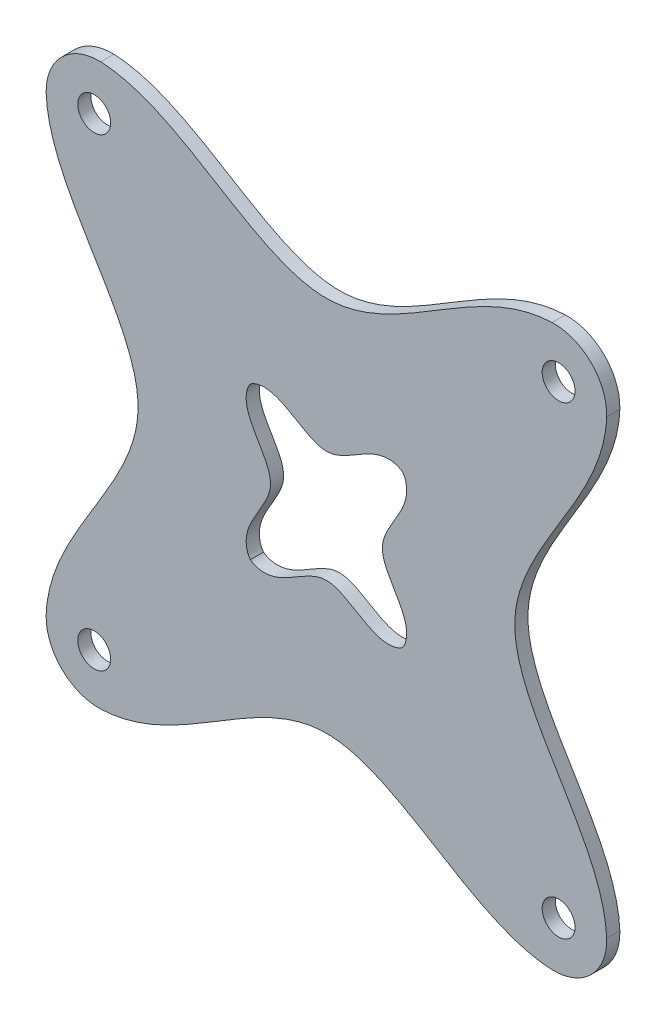
ISO-10303-21;
HEADER;
FILE_DESCRIPTION(('STEP AP214'),'2;1');
FILE_NAME('part.step','',(''),(''),'','','');
FILE_SCHEMA(('AUTOMOTIVE_DESIGN { 1 0 10303 214 1 1 1 1 }'));
ENDSEC;
DATA;
#1=APPLICATION_CONTEXT('core data for automotive mechanical design processes');
#2=APPLICATION_PROTOCOL_DEFINITION('international standard','automotive_design',2000,#1);
#3=PRODUCT_CONTEXT('',#1,'mechanical');
#4=PRODUCT('Part','Part','',(#3));
#5=PRODUCT_RELATED_PRODUCT_CATEGORY('part','',(#4));
#6=PRODUCT_DEFINITION_FORMATION('','',#4);
#7=PRODUCT_DEFINITION_CONTEXT('part definition',#1,'design');
#8=PRODUCT_DEFINITION('design','',#6,#7);
#9=PRODUCT_DEFINITION_SHAPE('','',#8);
#10=(LENGTH_UNIT() NAMED_UNIT(*) SI_UNIT(.MILLI.,.METRE.));
#11=(NAMED_UNIT(*) PLANE_ANGLE_UNIT() SI_UNIT($,.RADIAN.));
#12=(NAMED_UNIT(*) SI_UNIT($,.STERADIAN.) SOLID_ANGLE_UNIT());
#13=UNCERTAINTY_MEASURE_WITH_UNIT(LENGTH_MEASURE(1.E-05),#10,'distance_accuracy_value','');
#14=(GEOMETRIC_REPRESENTATION_CONTEXT(3) GLOBAL_UNCERTAINTY_ASSIGNED_CONTEXT((#13)) GLOBAL_UNIT_ASSIGNED_CONTEXT((#10,
#11,#12)) REPRESENTATION_CONTEXT('',''));
#15=CARTESIAN_POINT('',(0.,0.,0.));
#16=DIRECTION('',(0.,0.,1.));
#17=DIRECTION('',(1.,0.,0.));
#18=AXIS2_PLACEMENT_3D('',#15,#16,#17);
#19=CARTESIAN_POINT('',(21.9654081761549,-21.9654081758046,0.));
#20=DIRECTION('',(0.,0.,-1.));
#21=DIRECTION('',(-1.,0.,0.));
#22=AXIS2_PLACEMENT_3D('',#19,#20,#21);
#23=CYLINDRICAL_SURFACE('',#22,5.08);
#24=DIRECTION('',(0.,0.,-1.));
#25=VECTOR('',#24,1.);
#26=CARTESIAN_POINT('',(21.7825332933206,-27.0421154528917,0.));
#27=LINE('',#26,#25);
#28=CARTESIAN_POINT('',(21.7825332933206,-27.0421154528917,0.));
#29=VERTEX_POINT('',#28);
#30=CARTESIAN_POINT('',(21.7825332933206,-27.0421154528917,1.27));
#31=VERTEX_POINT('',#30);
#32=EDGE_CURVE('E257',#29,#31,#27,.F.);
#33=ORIENTED_EDGE('',*,*,#32,.F.);
#34=CARTESIAN_POINT('',(21.9654081761549,-21.9654081758046,0.));
#35=DIRECTION('',(0.,0.,1.));
#36=DIRECTION('',(1.,0.,0.));
#37=AXIS2_PLACEMENT_3D('',#34,#35,#36);
#38=CIRCLE('',#37,5.08);
#39=CARTESIAN_POINT('',(27.0421154532867,-21.782533294215,0.));
#40=VERTEX_POINT('',#39);
#41=EDGE_CURVE('E42',#40,#29,#38,.F.);
#42=ORIENTED_EDGE('',*,*,#41,.F.);
#43=DIRECTION('',(0.,0.,-1.));
#44=VECTOR('',#43,1.);
#45=CARTESIAN_POINT('',(27.0421154532867,-21.782533294215,1.27));
#46=LINE('',#45,#44);
#47=CARTESIAN_POINT('',(27.0421154532867,-21.782533294215,1.27));
#48=VERTEX_POINT('',#47);
#49=EDGE_CURVE('E260',#48,#40,#46,.T.);
#50=ORIENTED_EDGE('',*,*,#49,.F.);
#51=CARTESIAN_POINT('',(21.9654081761549,-21.9654081758046,1.27));
#52=DIRECTION('',(0.,0.,1.));
#53=DIRECTION('',(1.,0.,0.));
#54=AXIS2_PLACEMENT_3D('',#51,#52,#53);
#55=CIRCLE('',#54,5.08);
#56=EDGE_CURVE('E11',#31,#48,#55,.T.);
#57=ORIENTED_EDGE('',*,*,#56,.F.);
#58=EDGE_LOOP('',(#33,#42,#50,#57));
#59=FACE_BOUND('',#58,.T.);
#60=ADVANCED_FACE('F35',(#59),#23,.T.);
#61=CARTESIAN_POINT('',(-21.9654081757839,21.965408175578,1.27));
#62=DIRECTION('',(0.,0.,-1.));
#63=DIRECTION('',(-1.,0.,0.));
#64=AXIS2_PLACEMENT_3D('',#61,#62,#63);
#65=CYLINDRICAL_SURFACE('',#64,5.08);
#66=DIRECTION('',(0.,0.,-1.));
#67=VECTOR('',#66,1.);
#68=CARTESIAN_POINT('',(-27.0421154528519,21.7825332922171,1.27));
#69=LINE('',#68,#67);
#70=CARTESIAN_POINT('',(-27.0421154528519,21.7825332922171,1.27));
#71=VERTEX_POINT('',#70);
#72=CARTESIAN_POINT('',(-27.0421154528519,21.7825332922171,0.));
#73=VERTEX_POINT('',#72);
#74=EDGE_CURVE('E247',#71,#73,#69,.T.);
#75=ORIENTED_EDGE('',*,*,#74,.F.);
#76=CARTESIAN_POINT('',(-21.9654081757839,21.965408175578,1.27));
#77=DIRECTION('',(0.,0.,1.));
#78=DIRECTION('',(1.,0.,0.));
#79=AXIS2_PLACEMENT_3D('',#76,#77,#78);
#80=CIRCLE('',#79,5.08);
#81=CARTESIAN_POINT('',(-21.7825332916942,27.0421154526198,1.27));
#82=VERTEX_POINT('',#81);
#83=EDGE_CURVE('E253',#82,#71,#80,.T.);
#84=ORIENTED_EDGE('',*,*,#83,.F.);
#85=DIRECTION('',(0.,0.,-1.));
#86=VECTOR('',#85,1.);
#87=CARTESIAN_POINT('',(-21.7825332916942,27.0421154526198,0.));
#88=LINE('',#87,#86);
#89=CARTESIAN_POINT('',(-21.7825332916942,27.0421154526198,0.));
#90=VERTEX_POINT('',#89);
#91=EDGE_CURVE('E250',#90,#82,#88,.F.);
#92=ORIENTED_EDGE('',*,*,#91,.F.);
#93=CARTESIAN_POINT('',(-21.9654081757839,21.965408175578,0.));
#94=DIRECTION('',(0.,0.,1.));
#95=DIRECTION('',(1.,0.,0.));
#96=AXIS2_PLACEMENT_3D('',#93,#94,#95);
#97=CIRCLE('',#96,5.08);
#98=EDGE_CURVE('E255',#73,#90,#97,.F.);
#99=ORIENTED_EDGE('',*,*,#98,.F.);
#100=EDGE_LOOP('',(#75,#84,#92,#99));
#101=FACE_BOUND('',#100,.T.);
#102=ADVANCED_FACE('F285',(#101),#65,.T.);
#103=CARTESIAN_POINT('',(-21.9654081755703,-21.9654081755702,1.27));
#104=DIRECTION('',(0.,0.,-1.));
#105=DIRECTION('',(-1.,0.,0.));
#106=AXIS2_PLACEMENT_3D('',#103,#104,#105);
#107=CYLINDRICAL_SURFACE('',#106,5.08);
#108=DIRECTION('',(0.,0.,-1.));
#109=VECTOR('',#108,1.);
#110=CARTESIAN_POINT('',(-21.7825332912855,-27.042115452605,1.27));
#111=LINE('',#110,#109);
#112=CARTESIAN_POINT('',(-21.7825332912855,-27.042115452605,1.27));
#113=VERTEX_POINT('',#112);
#114=CARTESIAN_POINT('',(-21.7825332912855,-27.042115452605,0.));
#115=VERTEX_POINT('',#114);
#116=EDGE_CURVE('E236',#113,#115,#111,.T.);
#117=ORIENTED_EDGE('',*,*,#116,.F.);
#118=CARTESIAN_POINT('',(-21.9654081755703,-21.9654081755702,1.27));
#119=DIRECTION('',(0.,0.,1.));
#120=DIRECTION('',(1.,0.,0.));
#121=AXIS2_PLACEMENT_3D('',#118,#119,#120);
#122=CIRCLE('',#121,5.08);
#123=CARTESIAN_POINT('',(-27.042115452605,-21.7825332912856,1.27));
#124=VERTEX_POINT('',#123);
#125=EDGE_CURVE('E242',#124,#113,#122,.T.);
#126=ORIENTED_EDGE('',*,*,#125,.F.);
#127=DIRECTION('',(0.,0.,-1.));
#128=VECTOR('',#127,1.);
#129=CARTESIAN_POINT('',(-27.042115452605,-21.7825332912856,0.));
#130=LINE('',#129,#128);
#131=CARTESIAN_POINT('',(-27.042115452605,-21.7825332912856,0.));
#132=VERTEX_POINT('',#131);
#133=EDGE_CURVE('E239',#132,#124,#130,.F.);
#134=ORIENTED_EDGE('',*,*,#133,.F.);
#135=CARTESIAN_POINT('',(-21.9654081755703,-21.9654081755702,0.));
#136=DIRECTION('',(0.,0.,1.));
#137=DIRECTION('',(1.,0.,0.));
#138=AXIS2_PLACEMENT_3D('',#135,#136,#137);
#139=CIRCLE('',#138,5.08);
#140=EDGE_CURVE('E244',#115,#132,#139,.F.);
#141=ORIENTED_EDGE('',*,*,#140,.F.);
#142=EDGE_LOOP('',(#117,#126,#134,#141));
#143=FACE_BOUND('',#142,.T.);
#144=ADVANCED_FACE('F275',(#143),#107,.T.);
#145=CARTESIAN_POINT('',(21.965408175107,21.9654081757669,0.));
#146=DIRECTION('',(0.,0.,-1.));
#147=DIRECTION('',(-1.,0.,0.));
#148=AXIS2_PLACEMENT_3D('',#145,#146,#147);
#149=CYLINDRICAL_SURFACE('',#148,5.08);
#150=DIRECTION('',(0.,0.,-1.));
#151=VECTOR('',#150,1.);
#152=CARTESIAN_POINT('',(27.0421154520755,21.7825332896429,0.));
#153=LINE('',#152,#151);
#154=CARTESIAN_POINT('',(27.0421154520755,21.7825332896429,0.));
#155=VERTEX_POINT('',#154);
#156=CARTESIAN_POINT('',(27.0421154520755,21.7825332896429,1.27));
#157=VERTEX_POINT('',#156);
#158=EDGE_CURVE('E185',#155,#157,#153,.F.);
#159=ORIENTED_EDGE('',*,*,#158,.F.);
#160=CARTESIAN_POINT('',(21.965408175107,21.9654081757669,0.));
#161=DIRECTION('',(0.,0.,1.));
#162=DIRECTION('',(1.,0.,0.));
#163=AXIS2_PLACEMENT_3D('',#160,#161,#162);
#164=CIRCLE('',#163,5.08);
#165=CARTESIAN_POINT('',(21.7825332913162,27.0421154528195,0.));
#166=VERTEX_POINT('',#165);
#167=EDGE_CURVE('E231',#166,#155,#164,.F.);
#168=ORIENTED_EDGE('',*,*,#167,.F.);
#169=DIRECTION('',(0.,0.,-1.));
#170=VECTOR('',#169,1.);
#171=CARTESIAN_POINT('',(21.7825332913162,27.0421154528195,1.27));
#172=LINE('',#171,#170);
#173=CARTESIAN_POINT('',(21.7825332913162,27.0421154528195,1.27));
#174=VERTEX_POINT('',#173);
#175=EDGE_CURVE('E228',#174,#166,#172,.T.);
#176=ORIENTED_EDGE('',*,*,#175,.F.);
#177=CARTESIAN_POINT('',(21.965408175107,21.9654081757669,1.27));
#178=DIRECTION('',(0.,0.,1.));
#179=DIRECTION('',(1.,0.,0.));
#180=AXIS2_PLACEMENT_3D('',#177,#178,#179);
#181=CIRCLE('',#180,5.08);
#182=EDGE_CURVE('E234',#157,#174,#181,.T.);
#183=ORIENTED_EDGE('',*,*,#182,.F.);
#184=EDGE_LOOP('',(#159,#168,#176,#183));
#185=FACE_BOUND('',#184,.T.);
#186=ADVANCED_FACE('F291',(#185),#149,.T.);
#187=CARTESIAN_POINT('',(-26.0784512242138,26.0784512242138,1.27));
#188=CARTESIAN_POINT('',(-26.4668926901077,25.5950306717712,1.27));
#189=CARTESIAN_POINT('',(-29.5054367703831,16.2013722905775,1.27));
#190=CARTESIAN_POINT('',(-7.63665032782753,4.97957528785472E-10,1.27));
#191=CARTESIAN_POINT('',(-29.505436769622,-16.2013722917142,1.27));
#192=CARTESIAN_POINT('',(-26.4668926901906,-25.5950306717568,1.27));
#193=CARTESIAN_POINT('',(-26.0784512242138,-26.0784512242138,1.27));
#194=B_SPLINE_CURVE_WITH_KNOTS('',3,(#187,#188,#189,#190,#191,#192,#193),.UNSPECIFIED.,.F.,.F.,
(4,1,1,1,4),(0.0327667540954913,0.0655335081872653,0.49999999999634,0.934466491805415,
0.967233245900849),.UNSPECIFIED.);
#195=DIRECTION('',(0.,0.,-1.));
#196=VECTOR('',#195,1.);
#197=SURFACE_OF_LINEAR_EXTRUSION('',#194,#196);
#198=EDGE_CURVE('E222',#71,#124,#194,.T.);
#199=ORIENTED_EDGE('',*,*,#198,.F.);
#200=ORIENTED_EDGE('',*,*,#74,.T.);
#201=CARTESIAN_POINT('',(-26.0784512242138,26.0784512242138,0.));
#202=CARTESIAN_POINT('',(-26.4668926901077,25.5950306717712,0.));
#203=CARTESIAN_POINT('',(-29.5054367703831,16.2013722905775,0.));
#204=CARTESIAN_POINT('',(-7.63665032782753,4.97957528785472E-10,0.));
#205=CARTESIAN_POINT('',(-29.505436769622,-16.2013722917142,0.));
#206=CARTESIAN_POINT('',(-26.4668926901906,-25.5950306717568,0.));
#207=CARTESIAN_POINT('',(-26.0784512242138,-26.0784512242138,0.));
#208=B_SPLINE_CURVE_WITH_KNOTS('',3,(#201,#202,#203,#204,#205,#206,#207),.UNSPECIFIED.,.F.,.F.,
(4,1,1,1,4),(0.0327667540954913,0.0655335081872653,0.49999999999634,0.934466491805415,
0.967233245900849),.UNSPECIFIED.);
#209=EDGE_CURVE('E191',#73,#132,#208,.T.);
#210=ORIENTED_EDGE('',*,*,#209,.T.);
#211=ORIENTED_EDGE('',*,*,#133,.T.);
#212=EDGE_LOOP('',(#199,#200,#210,#211));
#213=FACE_BOUND('',#212,.T.);
#214=ADVANCED_FACE('F282',(#213),#197,.F.);
#215=CARTESIAN_POINT('',(-26.0784512242138,-26.0784512242138,1.27));
#216=CARTESIAN_POINT('',(-25.5950306717568,-26.4668926901906,1.27));
#217=CARTESIAN_POINT('',(-16.2013722917143,-29.5054367696219,1.27));
#218=CARTESIAN_POINT('',(4.97995116026007E-10,-7.63665032782758,1.27));
#219=CARTESIAN_POINT('',(16.2013722905775,-29.505436770383,1.27));
#220=CARTESIAN_POINT('',(25.5950306717712,-26.4668926901077,1.27));
#221=CARTESIAN_POINT('',(26.0784512242138,-26.0784512242138,1.27));
#222=B_SPLINE_CURVE_WITH_KNOTS('',3,(#215,#216,#217,#218,#219,#220,#221),.UNSPECIFIED.,.F.,.F.,
(4,1,1,1,4),(0.0327667540954913,0.0655335081909255,0.5,0.934466491809075,0.967233245900849),.UNSPECIFIED.);
#223=DIRECTION('',(0.,0.,-1.));
#224=VECTOR('',#223,1.);
#225=SURFACE_OF_LINEAR_EXTRUSION('',#222,#224);
#226=CARTESIAN_POINT('',(-26.0784512242138,-26.0784512242138,0.));
#227=CARTESIAN_POINT('',(-25.5950306717568,-26.4668926901906,0.));
#228=CARTESIAN_POINT('',(-16.2013722917143,-29.5054367696219,0.));
#229=CARTESIAN_POINT('',(4.97995116026007E-10,-7.63665032782758,0.));
#230=CARTESIAN_POINT('',(16.2013722905775,-29.505436770383,0.));
#231=CARTESIAN_POINT('',(25.5950306717712,-26.4668926901077,0.));
#232=CARTESIAN_POINT('',(26.0784512242138,-26.0784512242138,0.));
#233=B_SPLINE_CURVE_WITH_KNOTS('',3,(#226,#227,#228,#229,#230,#231,#232),.UNSPECIFIED.,.F.,.F.,
(4,1,1,1,4),(0.0327667540954913,0.0655335081909255,0.5,0.934466491809075,0.967233245900849),.UNSPECIFIED.);
#234=EDGE_CURVE('E198',#115,#29,#233,.T.);
#235=ORIENTED_EDGE('',*,*,#234,.T.);
#236=ORIENTED_EDGE('',*,*,#32,.T.);
#237=EDGE_CURVE('E272',#113,#31,#222,.T.);
#238=ORIENTED_EDGE('',*,*,#237,.F.);
#239=ORIENTED_EDGE('',*,*,#116,.T.);
#240=EDGE_LOOP('',(#235,#236,#238,#239));
#241=FACE_BOUND('',#240,.T.);
#242=ADVANCED_FACE('F270',(#241),#225,.F.);
#243=CARTESIAN_POINT('',(26.0784512242138,-26.0784512242138,1.27));
#244=CARTESIAN_POINT('',(26.4668926899683,-25.5950306717962,1.27));
#245=CARTESIAN_POINT('',(29.5054367716601,-16.201372288648,1.27));
#246=CARTESIAN_POINT('',(7.63665032804387,-2.44868862485965E-09,1.27));
#247=CARTESIAN_POINT('',(29.5054367679272,16.2013722942378,1.27));
#248=CARTESIAN_POINT('',(26.4668926903748,25.5950306717246,1.27));
#249=CARTESIAN_POINT('',(26.0784512242138,26.0784512242138,1.27));
#250=B_SPLINE_CURVE_WITH_KNOTS('',3,(#243,#244,#245,#246,#247,#248,#249),.UNSPECIFIED.,.F.,.F.,
(4,1,1,1,4),(0.0327667541053309,0.0655335081909253,0.5,0.934466491809075,0.967233245912644),.UNSPECIFIED.);
#251=DIRECTION('',(0.,0.,-1.));
#252=VECTOR('',#251,1.);
#253=SURFACE_OF_LINEAR_EXTRUSION('',#250,#252);
#254=EDGE_CURVE('E186',#48,#157,#250,.T.);
#255=ORIENTED_EDGE('',*,*,#254,.F.);
#256=ORIENTED_EDGE('',*,*,#49,.T.);
#257=CARTESIAN_POINT('',(26.0784512242138,-26.0784512242138,0.));
#258=CARTESIAN_POINT('',(26.4668926899683,-25.5950306717962,0.));
#259=CARTESIAN_POINT('',(29.5054367716601,-16.201372288648,0.));
#260=CARTESIAN_POINT('',(7.63665032804387,-2.44868862485965E-09,0.));
#261=CARTESIAN_POINT('',(29.5054367679272,16.2013722942378,0.));
#262=CARTESIAN_POINT('',(26.4668926903748,25.5950306717246,0.));
#263=CARTESIAN_POINT('',(26.0784512242138,26.0784512242138,0.));
#264=B_SPLINE_CURVE_WITH_KNOTS('',3,(#257,#258,#259,#260,#261,#262,#263),.UNSPECIFIED.,.F.,.F.,
(4,1,1,1,4),(0.0327667541053309,0.0655335081909253,0.5,0.934466491809075,0.967233245912644),.UNSPECIFIED.);
#265=EDGE_CURVE('E207',#40,#155,#264,.T.);
#266=ORIENTED_EDGE('',*,*,#265,.T.);
#267=ORIENTED_EDGE('',*,*,#158,.T.);
#268=EDGE_LOOP('',(#255,#256,#266,#267));
#269=FACE_BOUND('',#268,.T.);
#270=ADVANCED_FACE('F175',(#269),#253,.F.);
#271=CARTESIAN_POINT('',(26.0784512242138,26.0784512242138,1.27));
#272=CARTESIAN_POINT('',(25.5950306717712,26.4668926901077,1.27));
#273=CARTESIAN_POINT('',(16.2013722905775,29.5054367703831,1.27));
#274=CARTESIAN_POINT('',(4.97927742693554E-10,7.63665032782749,1.27));
#275=CARTESIAN_POINT('',(-16.2013722917142,29.505436769622,1.27));
#276=CARTESIAN_POINT('',(-25.5950306717568,26.4668926901906,1.27));
#277=CARTESIAN_POINT('',(-26.0784512242138,26.0784512242138,1.27));
#278=B_SPLINE_CURVE_WITH_KNOTS('',3,(#271,#272,#273,#274,#275,#276,#277),.UNSPECIFIED.,.F.,.F.,
(4,1,1,1,4),(0.0327667540954913,0.0655335081872656,0.49999999999634,0.934466491805415,
0.967233245900849),.UNSPECIFIED.);
#279=DIRECTION('',(0.,0.,-1.));
#280=VECTOR('',#279,1.);
#281=SURFACE_OF_LINEAR_EXTRUSION('',#278,#280);
#282=CARTESIAN_POINT('',(26.0784512242138,26.0784512242138,0.));
#283=CARTESIAN_POINT('',(25.5950306717712,26.4668926901077,0.));
#284=CARTESIAN_POINT('',(16.2013722905775,29.5054367703831,0.));
#285=CARTESIAN_POINT('',(4.97927742693554E-10,7.63665032782749,0.));
#286=CARTESIAN_POINT('',(-16.2013722917142,29.505436769622,0.));
#287=CARTESIAN_POINT('',(-25.5950306717568,26.4668926901906,0.));
#288=CARTESIAN_POINT('',(-26.0784512242138,26.0784512242138,0.));
#289=B_SPLINE_CURVE_WITH_KNOTS('',3,(#282,#283,#284,#285,#286,#287,#288),.UNSPECIFIED.,.F.,.F.,
(4,1,1,1,4),(0.0327667540954913,0.0655335081872656,0.49999999999634,0.934466491805415,
0.967233245900849),.UNSPECIFIED.);
#290=EDGE_CURVE('E214',#166,#90,#289,.T.);
#291=ORIENTED_EDGE('',*,*,#290,.T.);
#292=ORIENTED_EDGE('',*,*,#91,.T.);
#293=EDGE_CURVE('E179',#174,#82,#278,.T.);
#294=ORIENTED_EDGE('',*,*,#293,.F.);
#295=ORIENTED_EDGE('',*,*,#175,.T.);
#296=EDGE_LOOP('',(#291,#292,#294,#295));
#297=FACE_BOUND('',#296,.T.);
#298=ADVANCED_FACE('F167',(#297),#281,.F.);
#299=CARTESIAN_POINT('',(-18.1737,-9.863950377484E-11,1.27));
#300=DIRECTION('',(0.,0.,1.));
#301=DIRECTION('',(1.,0.,0.));
#302=AXIS2_PLACEMENT_3D('',#299,#300,#301);
#303=PLANE('',#302);
#304=CARTESIAN_POINT('',(22.4057390220675,-22.4057390220675,1.27));
#305=DIRECTION('',(0.,0.,1.));
#306=DIRECTION('',(1.,0.,0.));
#307=AXIS2_PLACEMENT_3D('',#304,#305,#306);
#308=CIRCLE('',#307,1.5875);
#309=CARTESIAN_POINT('',(23.9932390220675,-22.4057390220675,1.27));
#310=VERTEX_POINT('',#309);
#311=EDGE_CURVE('E487',#310,#310,#308,.T.);
#312=ORIENTED_EDGE('',*,*,#311,.F.);
#313=EDGE_LOOP('',(#312));
#314=FACE_BOUND('',#313,.T.);
#315=CARTESIAN_POINT('',(22.4057390220675,22.4057390220675,1.27));
#316=DIRECTION('',(0.,0.,1.));
#317=DIRECTION('',(1.,0.,0.));
#318=AXIS2_PLACEMENT_3D('',#315,#316,#317);
#319=CIRCLE('',#318,1.5875);
#320=CARTESIAN_POINT('',(23.9932390220675,22.4057390220675,1.27));
#321=VERTEX_POINT('',#320);
#322=EDGE_CURVE('E481',#321,#321,#319,.T.);
#323=ORIENTED_EDGE('',*,*,#322,.F.);
#324=EDGE_LOOP('',(#323));
#325=FACE_BOUND('',#324,.T.);
#326=CARTESIAN_POINT('',(-22.4057390220675,22.4057390220675,1.27));
#327=DIRECTION('',(0.,0.,1.));
#328=DIRECTION('',(1.,0.,0.));
#329=AXIS2_PLACEMENT_3D('',#326,#327,#328);
#330=CIRCLE('',#329,1.5875);
#331=CARTESIAN_POINT('',(-20.8182390220675,22.4057390220675,1.27));
#332=VERTEX_POINT('',#331);
#333=EDGE_CURVE('E475',#332,#332,#330,.T.);
#334=ORIENTED_EDGE('',*,*,#333,.F.);
#335=EDGE_LOOP('',(#334));
#336=FACE_BOUND('',#335,.T.);
#337=CARTESIAN_POINT('',(-22.4057390220675,-22.4057390220675,1.27));
#338=DIRECTION('',(0.,0.,1.));
#339=DIRECTION('',(1.,0.,0.));
#340=AXIS2_PLACEMENT_3D('',#337,#338,#339);
#341=CIRCLE('',#340,1.5875);
#342=CARTESIAN_POINT('',(-20.8182390220675,-22.4057390220675,1.27));
#343=VERTEX_POINT('',#342);
#344=EDGE_CURVE('E149',#343,#343,#341,.T.);
#345=ORIENTED_EDGE('',*,*,#344,.F.);
#346=EDGE_LOOP('',(#345));
#347=FACE_BOUND('',#346,.T.);
#348=CARTESIAN_POINT('',(-7.33692561210691,7.33692561210692,1.27));
#349=CARTESIAN_POINT('',(-7.53999049262532,7.09456495387122,1.27));
#350=CARTESIAN_POINT('',(-8.46751062910925,4.44168544808401,1.27));
#351=CARTESIAN_POINT('',(-2.70941912041997,-6.99705514788278E-12,1.27));
#352=CARTESIAN_POINT('',(-8.46751062911856,-4.44168544806628,1.27));
#353=CARTESIAN_POINT('',(-7.53999049262328,-7.09456495387186,1.27));
#354=CARTESIAN_POINT('',(-7.33692561210692,-7.33692561210691,1.27));
#355=B_SPLINE_CURVE_WITH_KNOTS('',3,(#348,#349,#350,#351,#352,#353,#354),.UNSPECIFIED.,.F.,.F.,
(4,1,1,1,4),(0.0553210234955911,0.110642046982983,0.5,0.889357953017018,0.944678976504082),.UNSPECIFIED.);
#356=CARTESIAN_POINT('',(-7.33692561210691,7.33692561210692,1.27));
#357=VERTEX_POINT('',#356);
#358=CARTESIAN_POINT('',(-7.33692561210692,-7.33692561210691,1.27));
#359=VERTEX_POINT('',#358);
#360=EDGE_CURVE('E49',#357,#359,#355,.T.);
#361=ORIENTED_EDGE('',*,*,#360,.F.);
#362=CARTESIAN_POINT('',(7.33692561210692,7.33692561210692,1.27));
#363=CARTESIAN_POINT('',(7.09456495387186,7.53999049262328,1.27));
#364=CARTESIAN_POINT('',(4.44168544806626,8.46751062911858,1.27));
#365=CARTESIAN_POINT('',(7.03317761171436E-12,2.70941912041998,1.27));
#366=CARTESIAN_POINT('',(-4.44168544808407,8.46751062910923,1.27));
#367=CARTESIAN_POINT('',(-7.09456495387122,7.53999049262532,1.27));
#368=CARTESIAN_POINT('',(-7.33692561210691,7.33692561210692,1.27));
#369=B_SPLINE_CURVE_WITH_KNOTS('',3,(#362,#363,#364,#365,#366,#367,#368),.UNSPECIFIED.,.F.,.F.,
(4,1,1,1,4),(0.0553210234955904,0.110642046982654,0.499999999999672,0.889357953016689,
0.944678976504082),.UNSPECIFIED.);
#370=CARTESIAN_POINT('',(7.33692561210692,7.33692561210692,1.27));
#371=VERTEX_POINT('',#370);
#372=EDGE_CURVE('E140',#371,#357,#369,.T.);
#373=ORIENTED_EDGE('',*,*,#372,.F.);
#374=CARTESIAN_POINT('',(7.33692561210692,-7.33692561210691,1.27));
#375=CARTESIAN_POINT('',(7.53999049262328,-7.09456495387186,1.27));
#376=CARTESIAN_POINT('',(8.46751062911857,-4.44168544806627,1.27));
#377=CARTESIAN_POINT('',(2.70941912041998,-7.00669512850193E-12,1.27));
#378=CARTESIAN_POINT('',(8.46751062910924,4.44168544808403,1.27));
#379=CARTESIAN_POINT('',(7.53999049262532,7.09456495387122,1.27));
#380=CARTESIAN_POINT('',(7.33692561210692,7.33692561210692,1.27));
#381=B_SPLINE_CURVE_WITH_KNOTS('',3,(#374,#375,#376,#377,#378,#379,#380),.UNSPECIFIED.,.F.,.F.,
(4,1,1,1,4),(0.0553210234955905,0.110642046982655,0.499999999999672,0.88935795301669,
0.944678976504082),.UNSPECIFIED.);
#382=CARTESIAN_POINT('',(7.33692561210692,-7.33692561210691,1.27));
#383=VERTEX_POINT('',#382);
#384=EDGE_CURVE('E143',#383,#371,#381,.T.);
#385=ORIENTED_EDGE('',*,*,#384,.F.);
#386=CARTESIAN_POINT('',(-7.33692561210692,-7.33692561210691,1.27));
#387=CARTESIAN_POINT('',(-7.09456495387166,-7.5399904926263,1.27));
#388=CARTESIAN_POINT('',(-4.4416854480895,-8.4675106291081,1.27));
#389=CARTESIAN_POINT('',(9.98293594625427E-11,-2.70941912034422,1.27));
#390=CARTESIAN_POINT('',(4.441685447835,-8.46751062926176,1.27));
#391=CARTESIAN_POINT('',(7.09456495387715,-7.53999049259185,1.27));
#392=CARTESIAN_POINT('',(7.33692561210692,-7.33692561210691,1.27));
#393=B_SPLINE_CURVE_WITH_KNOTS('',3,(#386,#387,#388,#389,#390,#391,#392),.UNSPECIFIED.,.F.,.F.,
(4,1,1,1,4),(0.0553210234955125,0.110642046982982,0.5,0.889357953017018,0.944678976499516),.UNSPECIFIED.);
#394=EDGE_CURVE('E440',#359,#383,#393,.T.);
#395=ORIENTED_EDGE('',*,*,#394,.F.);
#396=EDGE_LOOP('',(#361,#373,#385,#395));
#397=FACE_BOUND('',#396,.T.);
#398=ORIENTED_EDGE('',*,*,#237,.T.);
#399=ORIENTED_EDGE('',*,*,#56,.T.);
#400=ORIENTED_EDGE('',*,*,#254,.T.);
#401=ORIENTED_EDGE('',*,*,#182,.T.);
#402=ORIENTED_EDGE('',*,*,#293,.T.);
#403=ORIENTED_EDGE('',*,*,#83,.T.);
#404=ORIENTED_EDGE('',*,*,#198,.T.);
#405=ORIENTED_EDGE('',*,*,#125,.T.);
#406=EDGE_LOOP('',(#398,#399,#400,#401,#402,#403,#404,#405));
#407=FACE_BOUND('',#406,.T.);
#408=ADVANCED_FACE('F164',(#314,#325,#336,#347,#397,#407),#303,.T.);
#409=CARTESIAN_POINT('',(-18.1737,-9.863950377484E-11,0.));
#410=DIRECTION('',(0.,0.,1.));
#411=DIRECTION('',(1.,0.,0.));
#412=AXIS2_PLACEMENT_3D('',#409,#410,#411);
#413=PLANE('',#412);
#414=CARTESIAN_POINT('',(22.4057390220675,-22.4057390220675,0.));
#415=DIRECTION('',(0.,0.,1.));
#416=DIRECTION('',(1.,0.,0.));
#417=AXIS2_PLACEMENT_3D('',#414,#415,#416);
#418=CIRCLE('',#417,1.5875);
#419=CARTESIAN_POINT('',(23.9932390220675,-22.4057390220675,0.));
#420=VERTEX_POINT('',#419);
#421=EDGE_CURVE('E484',#420,#420,#418,.T.);
#422=ORIENTED_EDGE('',*,*,#421,.T.);
#423=EDGE_LOOP('',(#422));
#424=FACE_BOUND('',#423,.T.);
#425=CARTESIAN_POINT('',(22.4057390220675,22.4057390220675,0.));
#426=DIRECTION('',(0.,0.,1.));
#427=DIRECTION('',(1.,0.,0.));
#428=AXIS2_PLACEMENT_3D('',#425,#426,#427);
#429=CIRCLE('',#428,1.5875);
#430=CARTESIAN_POINT('',(23.9932390220675,22.4057390220675,0.));
#431=VERTEX_POINT('',#430);
#432=EDGE_CURVE('E478',#431,#431,#429,.T.);
#433=ORIENTED_EDGE('',*,*,#432,.T.);
#434=EDGE_LOOP('',(#433));
#435=FACE_BOUND('',#434,.T.);
#436=CARTESIAN_POINT('',(-22.4057390220675,22.4057390220675,0.));
#437=DIRECTION('',(0.,0.,1.));
#438=DIRECTION('',(1.,0.,0.));
#439=AXIS2_PLACEMENT_3D('',#436,#437,#438);
#440=CIRCLE('',#439,1.5875);
#441=CARTESIAN_POINT('',(-20.8182390220675,22.4057390220675,0.));
#442=VERTEX_POINT('',#441);
#443=EDGE_CURVE('E473',#442,#442,#440,.T.);
#444=ORIENTED_EDGE('',*,*,#443,.T.);
#445=EDGE_LOOP('',(#444));
#446=FACE_BOUND('',#445,.T.);
#447=CARTESIAN_POINT('',(-22.4057390220675,-22.4057390220675,0.));
#448=DIRECTION('',(0.,0.,1.));
#449=DIRECTION('',(1.,0.,0.));
#450=AXIS2_PLACEMENT_3D('',#447,#448,#449);
#451=CIRCLE('',#450,1.5875);
#452=CARTESIAN_POINT('',(-20.8182390220675,-22.4057390220675,0.));
#453=VERTEX_POINT('',#452);
#454=EDGE_CURVE('E441',#453,#453,#451,.T.);
#455=ORIENTED_EDGE('',*,*,#454,.T.);
#456=EDGE_LOOP('',(#455));
#457=FACE_BOUND('',#456,.T.);
#458=CARTESIAN_POINT('',(7.33692561210692,7.33692561210692,0.));
#459=CARTESIAN_POINT('',(7.09456495387186,7.53999049262328,0.));
#460=CARTESIAN_POINT('',(4.44168544806626,8.46751062911858,0.));
#461=CARTESIAN_POINT('',(7.03317761171436E-12,2.70941912041998,0.));
#462=CARTESIAN_POINT('',(-4.44168544808407,8.46751062910923,0.));
#463=CARTESIAN_POINT('',(-7.09456495387122,7.53999049262532,0.));
#464=CARTESIAN_POINT('',(-7.33692561210691,7.33692561210692,0.));
#465=B_SPLINE_CURVE_WITH_KNOTS('',3,(#458,#459,#460,#461,#462,#463,#464),.UNSPECIFIED.,.F.,.F.,
(4,1,1,1,4),(0.0553210234955904,0.110642046982654,0.499999999999672,0.889357953016689,
0.944678976504082),.UNSPECIFIED.);
#466=CARTESIAN_POINT('',(7.33692561210692,7.33692561210692,0.));
#467=VERTEX_POINT('',#466);
#468=CARTESIAN_POINT('',(-7.33692561210691,7.33692561210692,0.));
#469=VERTEX_POINT('',#468);
#470=EDGE_CURVE('E130',#467,#469,#465,.T.);
#471=ORIENTED_EDGE('',*,*,#470,.T.);
#472=CARTESIAN_POINT('',(-7.33692561210691,7.33692561210692,0.));
#473=CARTESIAN_POINT('',(-7.53999049262532,7.09456495387122,0.));
#474=CARTESIAN_POINT('',(-8.46751062910925,4.44168544808401,0.));
#475=CARTESIAN_POINT('',(-2.70941912041997,-6.99705514788278E-12,0.));
#476=CARTESIAN_POINT('',(-8.46751062911856,-4.44168544806628,0.));
#477=CARTESIAN_POINT('',(-7.53999049262328,-7.09456495387186,0.));
#478=CARTESIAN_POINT('',(-7.33692561210692,-7.33692561210691,0.));
#479=B_SPLINE_CURVE_WITH_KNOTS('',3,(#472,#473,#474,#475,#476,#477,#478),.UNSPECIFIED.,.F.,.F.,
(4,1,1,1,4),(0.0553210234955911,0.110642046982983,0.5,0.889357953017018,0.944678976504082),.UNSPECIFIED.);
#480=CARTESIAN_POINT('',(-7.33692561210692,-7.33692561210691,0.));
#481=VERTEX_POINT('',#480);
#482=EDGE_CURVE('E124',#469,#481,#479,.T.);
#483=ORIENTED_EDGE('',*,*,#482,.T.);
#484=CARTESIAN_POINT('',(-7.33692561210692,-7.33692561210691,0.));
#485=CARTESIAN_POINT('',(-7.09456495387166,-7.5399904926263,0.));
#486=CARTESIAN_POINT('',(-4.4416854480895,-8.4675106291081,0.));
#487=CARTESIAN_POINT('',(9.98293594625427E-11,-2.70941912034422,0.));
#488=CARTESIAN_POINT('',(4.441685447835,-8.46751062926176,0.));
#489=CARTESIAN_POINT('',(7.09456495387715,-7.53999049259185,0.));
#490=CARTESIAN_POINT('',(7.33692561210692,-7.33692561210691,0.));
#491=B_SPLINE_CURVE_WITH_KNOTS('',3,(#484,#485,#486,#487,#488,#489,#490),.UNSPECIFIED.,.F.,.F.,
(4,1,1,1,4),(0.0553210234955125,0.110642046982982,0.5,0.889357953017018,0.944678976499516),.UNSPECIFIED.);
#492=CARTESIAN_POINT('',(7.33692561210692,-7.33692561210691,0.));
#493=VERTEX_POINT('',#492);
#494=EDGE_CURVE('E133',#481,#493,#491,.T.);
#495=ORIENTED_EDGE('',*,*,#494,.T.);
#496=CARTESIAN_POINT('',(7.33692561210692,-7.33692561210691,0.));
#497=CARTESIAN_POINT('',(7.53999049262328,-7.09456495387186,0.));
#498=CARTESIAN_POINT('',(8.46751062911857,-4.44168544806627,0.));
#499=CARTESIAN_POINT('',(2.70941912041998,-7.00669512850193E-12,0.));
#500=CARTESIAN_POINT('',(8.46751062910924,4.44168544808403,0.));
#501=CARTESIAN_POINT('',(7.53999049262532,7.09456495387122,0.));
#502=CARTESIAN_POINT('',(7.33692561210692,7.33692561210692,0.));
#503=B_SPLINE_CURVE_WITH_KNOTS('',3,(#496,#497,#498,#499,#500,#501,#502),.UNSPECIFIED.,.F.,.F.,
(4,1,1,1,4),(0.0553210234955905,0.110642046982655,0.499999999999672,0.88935795301669,
0.944678976504082),.UNSPECIFIED.);
#504=EDGE_CURVE('E57',#493,#467,#503,.T.);
#505=ORIENTED_EDGE('',*,*,#504,.T.);
#506=EDGE_LOOP('',(#471,#483,#495,#505));
#507=FACE_BOUND('',#506,.T.);
#508=ORIENTED_EDGE('',*,*,#265,.F.);
#509=ORIENTED_EDGE('',*,*,#41,.T.);
#510=ORIENTED_EDGE('',*,*,#234,.F.);
#511=ORIENTED_EDGE('',*,*,#140,.T.);
#512=ORIENTED_EDGE('',*,*,#209,.F.);
#513=ORIENTED_EDGE('',*,*,#98,.T.);
#514=ORIENTED_EDGE('',*,*,#290,.F.);
#515=ORIENTED_EDGE('',*,*,#167,.T.);
#516=EDGE_LOOP('',(#508,#509,#510,#511,#512,#513,#514,#515));
#517=FACE_BOUND('',#516,.T.);
#518=ADVANCED_FACE('F137',(#424,#435,#446,#457,#507,#517),#413,.F.);
#519=DIRECTION('',(0.,0.,1.));
#520=VECTOR('',#519,1.);
#521=SURFACE_OF_LINEAR_EXTRUSION('',#479,#520);
#522=ORIENTED_EDGE('',*,*,#360,.T.);
#523=DIRECTION('',(0.,0.,1.));
#524=VECTOR('',#523,1.);
#525=CARTESIAN_POINT('',(-7.33692561210692,-7.33692561210691,0.));
#526=LINE('',#525,#524);
#527=EDGE_CURVE('E120',#481,#359,#526,.T.);
#528=ORIENTED_EDGE('',*,*,#527,.F.);
#529=ORIENTED_EDGE('',*,*,#482,.F.);
#530=DIRECTION('',(0.,0.,1.));
#531=VECTOR('',#530,1.);
#532=CARTESIAN_POINT('',(-7.33692561210691,7.33692561210692,0.));
#533=LINE('',#532,#531);
#534=EDGE_CURVE('E199',#469,#357,#533,.T.);
#535=ORIENTED_EDGE('',*,*,#534,.T.);
#536=EDGE_LOOP('',(#522,#528,#529,#535));
#537=FACE_BOUND('',#536,.T.);
#538=ADVANCED_FACE('F122',(#537),#521,.F.);
#539=DIRECTION('',(0.,0.,1.));
#540=VECTOR('',#539,1.);
#541=SURFACE_OF_LINEAR_EXTRUSION('',#465,#540);
#542=ORIENTED_EDGE('',*,*,#372,.T.);
#543=ORIENTED_EDGE('',*,*,#534,.F.);
#544=ORIENTED_EDGE('',*,*,#470,.F.);
#545=DIRECTION('',(0.,0.,1.));
#546=VECTOR('',#545,1.);
#547=CARTESIAN_POINT('',(7.33692561210692,7.33692561210692,0.));
#548=LINE('',#547,#546);
#549=EDGE_CURVE('E464',#467,#371,#548,.T.);
#550=ORIENTED_EDGE('',*,*,#549,.T.);
#551=EDGE_LOOP('',(#542,#543,#544,#550));
#552=FACE_BOUND('',#551,.T.);
#553=ADVANCED_FACE('F162',(#552),#541,.F.);
#554=DIRECTION('',(0.,0.,1.));
#555=VECTOR('',#554,1.);
#556=SURFACE_OF_LINEAR_EXTRUSION('',#503,#555);
#557=ORIENTED_EDGE('',*,*,#384,.T.);
#558=ORIENTED_EDGE('',*,*,#549,.F.);
#559=ORIENTED_EDGE('',*,*,#504,.F.);
#560=DIRECTION('',(0.,0.,1.));
#561=VECTOR('',#560,1.);
#562=CARTESIAN_POINT('',(7.33692561210692,-7.33692561210691,0.));
#563=LINE('',#562,#561);
#564=EDGE_CURVE('E129',#493,#383,#563,.T.);
#565=ORIENTED_EDGE('',*,*,#564,.T.);
#566=EDGE_LOOP('',(#557,#558,#559,#565));
#567=FACE_BOUND('',#566,.T.);
#568=ADVANCED_FACE('F365',(#567),#556,.F.);
#569=DIRECTION('',(0.,0.,1.));
#570=VECTOR('',#569,1.);
#571=SURFACE_OF_LINEAR_EXTRUSION('',#491,#570);
#572=ORIENTED_EDGE('',*,*,#394,.T.);
#573=ORIENTED_EDGE('',*,*,#564,.F.);
#574=ORIENTED_EDGE('',*,*,#494,.F.);
#575=ORIENTED_EDGE('',*,*,#527,.T.);
#576=EDGE_LOOP('',(#572,#573,#574,#575));
#577=FACE_BOUND('',#576,.T.);
#578=ADVANCED_FACE('F134',(#577),#571,.F.);
#579=CARTESIAN_POINT('',(-22.4057390220675,-22.4057390220675,0.));
#580=DIRECTION('',(0.,0.,1.));
#581=DIRECTION('',(1.,0.,0.));
#582=AXIS2_PLACEMENT_3D('',#579,#580,#581);
#583=CYLINDRICAL_SURFACE('',#582,1.5875);
#584=ORIENTED_EDGE('',*,*,#454,.F.);
#585=EDGE_LOOP('',(#584));
#586=FACE_BOUND('',#585,.T.);
#587=ORIENTED_EDGE('',*,*,#344,.T.);
#588=EDGE_LOOP('',(#587));
#589=FACE_BOUND('',#588,.T.);
#590=ADVANCED_FACE('F382',(#586,#589),#583,.F.);
#591=CARTESIAN_POINT('',(-22.4057390220675,22.4057390220675,0.));
#592=DIRECTION('',(0.,0.,1.));
#593=DIRECTION('',(1.,0.,0.));
#594=AXIS2_PLACEMENT_3D('',#591,#592,#593);
#595=CYLINDRICAL_SURFACE('',#594,1.5875);
#596=ORIENTED_EDGE('',*,*,#443,.F.);
#597=EDGE_LOOP('',(#596));
#598=FACE_BOUND('',#597,.T.);
#599=ORIENTED_EDGE('',*,*,#333,.T.);
#600=EDGE_LOOP('',(#599));
#601=FACE_BOUND('',#600,.T.);
#602=ADVANCED_FACE('F390',(#598,#601),#595,.F.);
#603=CARTESIAN_POINT('',(22.4057390220675,22.4057390220675,0.));
#604=DIRECTION('',(0.,0.,1.));
#605=DIRECTION('',(1.,0.,0.));
#606=AXIS2_PLACEMENT_3D('',#603,#604,#605);
#607=CYLINDRICAL_SURFACE('',#606,1.5875);
#608=ORIENTED_EDGE('',*,*,#432,.F.);
#609=EDGE_LOOP('',(#608));
#610=FACE_BOUND('',#609,.T.);
#611=ORIENTED_EDGE('',*,*,#322,.T.);
#612=EDGE_LOOP('',(#611));
#613=FACE_BOUND('',#612,.T.);
#614=ADVANCED_FACE('F400',(#610,#613),#607,.F.);
#615=CARTESIAN_POINT('',(22.4057390220675,-22.4057390220675,0.));
#616=DIRECTION('',(0.,0.,1.));
#617=DIRECTION('',(1.,0.,0.));
#618=AXIS2_PLACEMENT_3D('',#615,#616,#617);
#619=CYLINDRICAL_SURFACE('',#618,1.5875);
#620=ORIENTED_EDGE('',*,*,#421,.F.);
#621=EDGE_LOOP('',(#620));
#622=FACE_BOUND('',#621,.T.);
#623=ORIENTED_EDGE('',*,*,#311,.T.);
#624=EDGE_LOOP('',(#623));
#625=FACE_BOUND('',#624,.T.);
#626=ADVANCED_FACE('F410',(#622,#625),#619,.F.);
#627=CLOSED_SHELL('',(#60,#102,#144,#186,#214,#242,#270,#298,#408,#518,#538,#553,#568,#578,#590,
#602,#614,#626));
#628=MANIFOLD_SOLID_BREP('B2',#627);
#629=ADVANCED_BREP_SHAPE_REPRESENTATION('',(#18,#628),#14);
#630=SHAPE_DEFINITION_REPRESENTATION(#9,#629);
ENDSEC;
END-ISO-10303-21;
